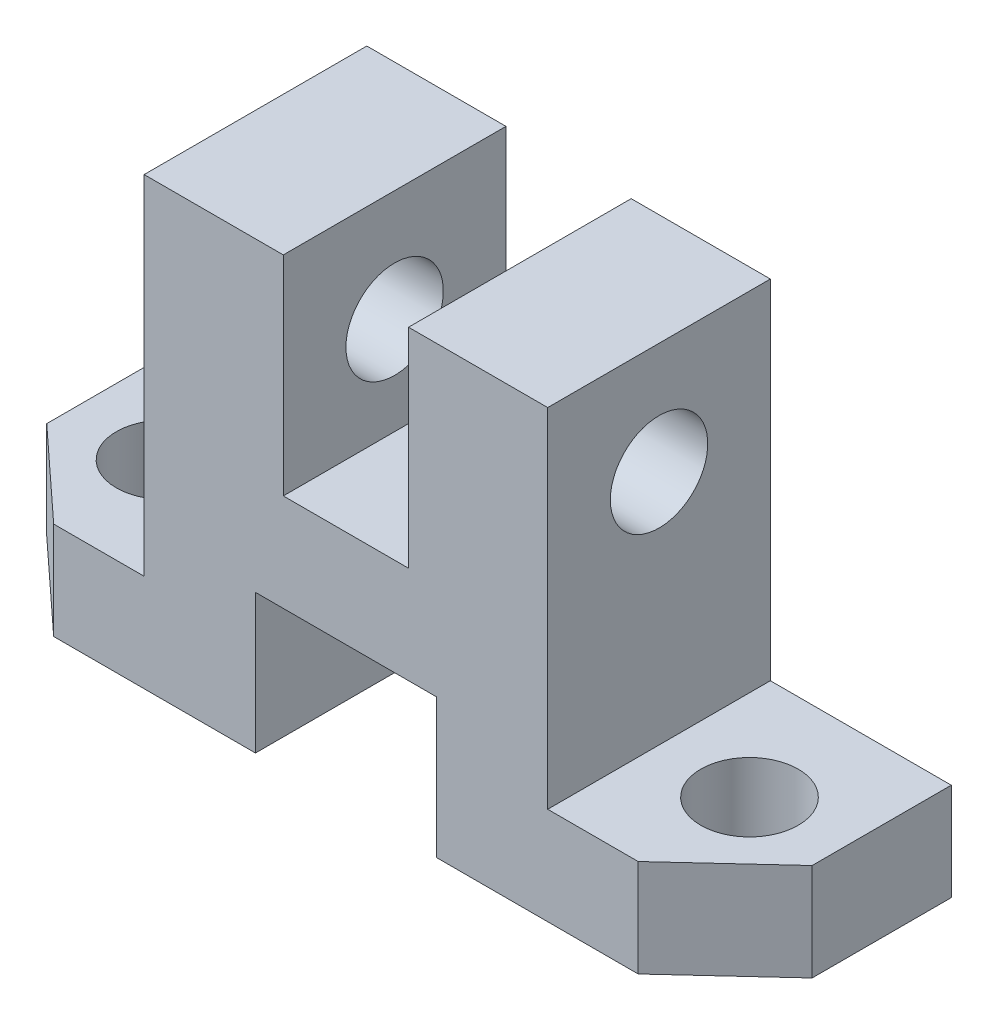
ISO-10303-21;
HEADER;
FILE_DESCRIPTION(('STEP AP214'),'2;1');
FILE_NAME('part.step','',(''),(''),'','','');
FILE_SCHEMA(('AUTOMOTIVE_DESIGN { 1 0 10303 214 1 1 1 1 }'));
ENDSEC;
DATA;
#1=APPLICATION_CONTEXT('core data for automotive mechanical design processes');
#2=APPLICATION_PROTOCOL_DEFINITION('international standard','automotive_design',2000,#1);
#3=PRODUCT_CONTEXT('',#1,'mechanical');
#4=PRODUCT('Part','Part','',(#3));
#5=PRODUCT_RELATED_PRODUCT_CATEGORY('part','',(#4));
#6=PRODUCT_DEFINITION_FORMATION('','',#4);
#7=PRODUCT_DEFINITION_CONTEXT('part definition',#1,'design');
#8=PRODUCT_DEFINITION('design','',#6,#7);
#9=PRODUCT_DEFINITION_SHAPE('','',#8);
#10=(LENGTH_UNIT() NAMED_UNIT(*) SI_UNIT(.MILLI.,.METRE.));
#11=(NAMED_UNIT(*) PLANE_ANGLE_UNIT() SI_UNIT($,.RADIAN.));
#12=(NAMED_UNIT(*) SI_UNIT($,.STERADIAN.) SOLID_ANGLE_UNIT());
#13=UNCERTAINTY_MEASURE_WITH_UNIT(LENGTH_MEASURE(1.E-05),#10,'distance_accuracy_value','');
#14=(GEOMETRIC_REPRESENTATION_CONTEXT(3) GLOBAL_UNCERTAINTY_ASSIGNED_CONTEXT((#13)) GLOBAL_UNIT_ASSIGNED_CONTEXT((#10,
#11,#12)) REPRESENTATION_CONTEXT('',''));
#15=CARTESIAN_POINT('',(0.,0.,0.));
#16=DIRECTION('',(0.,0.,1.));
#17=DIRECTION('',(1.,0.,0.));
#18=AXIS2_PLACEMENT_3D('',#15,#16,#17);
#19=CARTESIAN_POINT('',(0.,0.,16.));
#20=DIRECTION('',(1.,0.,0.));
#21=DIRECTION('',(0.,0.,-1.));
#22=AXIS2_PLACEMENT_3D('',#19,#20,#21);
#23=PLANE('',#22);
#24=DIRECTION('',(0.,1.,0.));
#25=VECTOR('',#24,1.);
#26=CARTESIAN_POINT('',(0.,0.,10.));
#27=LINE('',#26,#25);
#28=CARTESIAN_POINT('',(0.,0.,10.));
#29=VERTEX_POINT('',#28);
#30=CARTESIAN_POINT('',(0.,7.,10.));
#31=VERTEX_POINT('',#30);
#32=EDGE_CURVE('E402',#29,#31,#27,.T.);
#33=ORIENTED_EDGE('',*,*,#32,.T.);
#34=DIRECTION('',(0.,0.,-1.));
#35=VECTOR('',#34,1.);
#36=CARTESIAN_POINT('',(0.,7.,16.));
#37=LINE('',#36,#35);
#38=CARTESIAN_POINT('',(0.,7.,0.));
#39=VERTEX_POINT('',#38);
#40=EDGE_CURVE('E276',#31,#39,#37,.T.);
#41=ORIENTED_EDGE('',*,*,#40,.T.);
#42=DIRECTION('',(0.,-1.,0.));
#43=VECTOR('',#42,1.);
#44=CARTESIAN_POINT('',(0.,0.,0.));
#45=LINE('',#44,#43);
#46=CARTESIAN_POINT('',(0.,0.,0.));
#47=VERTEX_POINT('',#46);
#48=EDGE_CURVE('E236',#39,#47,#45,.T.);
#49=ORIENTED_EDGE('',*,*,#48,.T.);
#50=DIRECTION('',(0.,0.,-1.));
#51=VECTOR('',#50,1.);
#52=CARTESIAN_POINT('',(0.,0.,16.));
#53=LINE('',#52,#51);
#54=EDGE_CURVE('E11',#29,#47,#53,.T.);
#55=ORIENTED_EDGE('',*,*,#54,.F.);
#56=EDGE_LOOP('',(#33,#41,#49,#55));
#57=FACE_BOUND('',#56,.T.);
#58=ADVANCED_FACE('F43',(#57),#23,.F.);
#59=CARTESIAN_POINT('',(0.,0.,16.));
#60=DIRECTION('',(0.,1.,0.));
#61=DIRECTION('',(0.,0.,1.));
#62=AXIS2_PLACEMENT_3D('',#59,#60,#61);
#63=PLANE('',#62);
#64=CARTESIAN_POINT('',(6.5,0.,8.));
#65=DIRECTION('',(0.,1.,0.));
#66=DIRECTION('',(0.,0.,1.));
#67=AXIS2_PLACEMENT_3D('',#64,#65,#66);
#68=CIRCLE('',#67,3.5);
#69=CARTESIAN_POINT('',(6.5,0.,11.5));
#70=VERTEX_POINT('',#69);
#71=EDGE_CURVE('E355',#70,#70,#68,.T.);
#72=ORIENTED_EDGE('',*,*,#71,.T.);
#73=EDGE_LOOP('',(#72));
#74=FACE_BOUND('',#73,.T.);
#75=DIRECTION('',(0.734803444627487,0.,0.678280102733066));
#76=VECTOR('',#75,1.);
#77=CARTESIAN_POINT('',(0.,0.,10.));
#78=LINE('',#77,#76);
#79=CARTESIAN_POINT('',(6.5,0.,16.));
#80=VERTEX_POINT('',#79);
#81=EDGE_CURVE('E67',#29,#80,#78,.T.);
#82=ORIENTED_EDGE('',*,*,#81,.F.);
#83=ORIENTED_EDGE('',*,*,#54,.T.);
#84=DIRECTION('',(1.,0.,0.));
#85=VECTOR('',#84,1.);
#86=CARTESIAN_POINT('',(0.,0.,0.));
#87=LINE('',#86,#85);
#88=CARTESIAN_POINT('',(21.,0.,0.));
#89=VERTEX_POINT('',#88);
#90=EDGE_CURVE('E226',#47,#89,#87,.T.);
#91=ORIENTED_EDGE('',*,*,#90,.T.);
#92=DIRECTION('',(0.,0.,-1.));
#93=VECTOR('',#92,1.);
#94=CARTESIAN_POINT('',(21.,0.,16.));
#95=LINE('',#94,#93);
#96=CARTESIAN_POINT('',(21.,0.,16.));
#97=VERTEX_POINT('',#96);
#98=EDGE_CURVE('E52',#97,#89,#95,.T.);
#99=ORIENTED_EDGE('',*,*,#98,.F.);
#100=DIRECTION('',(1.,0.,0.));
#101=VECTOR('',#100,1.);
#102=CARTESIAN_POINT('',(0.,0.,16.));
#103=LINE('',#102,#101);
#104=EDGE_CURVE('E275',#80,#97,#103,.T.);
#105=ORIENTED_EDGE('',*,*,#104,.F.);
#106=EDGE_LOOP('',(#82,#83,#91,#99,#105));
#107=FACE_BOUND('',#106,.T.);
#108=ADVANCED_FACE('F442',(#74,#107),#63,.F.);
#109=CARTESIAN_POINT('',(0.,7.,16.));
#110=DIRECTION('',(0.,-1.,0.));
#111=DIRECTION('',(0.,0.,-1.));
#112=AXIS2_PLACEMENT_3D('',#109,#110,#111);
#113=PLANE('',#112);
#114=CARTESIAN_POINT('',(6.5,7.,8.));
#115=DIRECTION('',(0.,1.,0.));
#116=DIRECTION('',(0.,0.,1.));
#117=AXIS2_PLACEMENT_3D('',#114,#115,#116);
#118=CIRCLE('',#117,3.5);
#119=CARTESIAN_POINT('',(6.5,7.,11.5));
#120=VERTEX_POINT('',#119);
#121=EDGE_CURVE('E360',#120,#120,#118,.T.);
#122=ORIENTED_EDGE('',*,*,#121,.F.);
#123=EDGE_LOOP('',(#122));
#124=FACE_BOUND('',#123,.T.);
#125=DIRECTION('',(0.734803444627487,0.,0.678280102733066));
#126=VECTOR('',#125,1.);
#127=CARTESIAN_POINT('',(0.,7.,10.));
#128=LINE('',#127,#126);
#129=CARTESIAN_POINT('',(6.5,7.,16.));
#130=VERTEX_POINT('',#129);
#131=EDGE_CURVE('E392',#31,#130,#128,.T.);
#132=ORIENTED_EDGE('',*,*,#131,.T.);
#133=DIRECTION('',(-1.,0.,0.));
#134=VECTOR('',#133,1.);
#135=CARTESIAN_POINT('',(0.,7.,16.));
#136=LINE('',#135,#134);
#137=CARTESIAN_POINT('',(13.,7.,16.));
#138=VERTEX_POINT('',#137);
#139=EDGE_CURVE('E280',#138,#130,#136,.T.);
#140=ORIENTED_EDGE('',*,*,#139,.F.);
#141=DIRECTION('',(0.,0.,-1.));
#142=VECTOR('',#141,1.);
#143=CARTESIAN_POINT('',(13.,7.,16.));
#144=LINE('',#143,#142);
#145=CARTESIAN_POINT('',(13.,7.,0.));
#146=VERTEX_POINT('',#145);
#147=EDGE_CURVE('E279',#138,#146,#144,.T.);
#148=ORIENTED_EDGE('',*,*,#147,.T.);
#149=DIRECTION('',(-1.,0.,0.));
#150=VECTOR('',#149,1.);
#151=CARTESIAN_POINT('',(0.,7.,0.));
#152=LINE('',#151,#150);
#153=EDGE_CURVE('E271',#146,#39,#152,.T.);
#154=ORIENTED_EDGE('',*,*,#153,.T.);
#155=ORIENTED_EDGE('',*,*,#40,.F.);
#156=EDGE_LOOP('',(#132,#140,#148,#154,#155));
#157=FACE_BOUND('',#156,.T.);
#158=ADVANCED_FACE('F446',(#124,#157),#113,.F.);
#159=CARTESIAN_POINT('',(0.,0.,16.));
#160=DIRECTION('',(0.,0.,-1.));
#161=DIRECTION('',(-1.,0.,0.));
#162=AXIS2_PLACEMENT_3D('',#159,#160,#161);
#163=PLANE('',#162);
#164=DIRECTION('',(1.,0.,0.));
#165=VECTOR('',#164,1.);
#166=CARTESIAN_POINT('',(34.,0.,16.));
#167=LINE('',#166,#165);
#168=CARTESIAN_POINT('',(34.,0.,16.));
#169=VERTEX_POINT('',#168);
#170=CARTESIAN_POINT('',(48.5,0.,16.));
#171=VERTEX_POINT('',#170);
#172=EDGE_CURVE('E380',#169,#171,#167,.T.);
#173=ORIENTED_EDGE('',*,*,#172,.T.);
#174=DIRECTION('',(0.,1.,0.));
#175=VECTOR('',#174,1.);
#176=CARTESIAN_POINT('',(48.5,0.,16.));
#177=LINE('',#176,#175);
#178=CARTESIAN_POINT('',(48.5,7.,16.));
#179=VERTEX_POINT('',#178);
#180=EDGE_CURVE('E169',#171,#179,#177,.T.);
#181=ORIENTED_EDGE('',*,*,#180,.T.);
#182=DIRECTION('',(-1.,0.,0.));
#183=VECTOR('',#182,1.);
#184=CARTESIAN_POINT('',(42.,7.,16.));
#185=LINE('',#184,#183);
#186=CARTESIAN_POINT('',(42.,7.,16.));
#187=VERTEX_POINT('',#186);
#188=EDGE_CURVE('E383',#179,#187,#185,.T.);
#189=ORIENTED_EDGE('',*,*,#188,.T.);
#190=DIRECTION('',(0.,1.,0.));
#191=VECTOR('',#190,1.);
#192=CARTESIAN_POINT('',(42.,32.,16.));
#193=LINE('',#192,#191);
#194=CARTESIAN_POINT('',(42.,32.,16.));
#195=VERTEX_POINT('',#194);
#196=EDGE_CURVE('E315',#187,#195,#193,.T.);
#197=ORIENTED_EDGE('',*,*,#196,.T.);
#198=DIRECTION('',(-1.,0.,0.));
#199=VECTOR('',#198,1.);
#200=CARTESIAN_POINT('',(32.,32.,16.));
#201=LINE('',#200,#199);
#202=CARTESIAN_POINT('',(32.,32.,16.));
#203=VERTEX_POINT('',#202);
#204=EDGE_CURVE('E335',#195,#203,#201,.T.);
#205=ORIENTED_EDGE('',*,*,#204,.T.);
#206=DIRECTION('',(0.,-1.,0.));
#207=VECTOR('',#206,1.);
#208=CARTESIAN_POINT('',(32.,17.,16.));
#209=LINE('',#208,#207);
#210=CARTESIAN_POINT('',(32.,17.,16.));
#211=VERTEX_POINT('',#210);
#212=EDGE_CURVE('E330',#203,#211,#209,.T.);
#213=ORIENTED_EDGE('',*,*,#212,.T.);
#214=DIRECTION('',(-1.,0.,0.));
#215=VECTOR('',#214,1.);
#216=CARTESIAN_POINT('',(23.,17.,16.));
#217=LINE('',#216,#215);
#218=CARTESIAN_POINT('',(23.,17.,16.));
#219=VERTEX_POINT('',#218);
#220=EDGE_CURVE('E334',#211,#219,#217,.T.);
#221=ORIENTED_EDGE('',*,*,#220,.T.);
#222=DIRECTION('',(0.,1.,0.));
#223=VECTOR('',#222,1.);
#224=CARTESIAN_POINT('',(23.,32.,16.));
#225=LINE('',#224,#223);
#226=CARTESIAN_POINT('',(23.,32.,16.));
#227=VERTEX_POINT('',#226);
#228=EDGE_CURVE('E339',#219,#227,#225,.T.);
#229=ORIENTED_EDGE('',*,*,#228,.T.);
#230=DIRECTION('',(-1.,0.,0.));
#231=VECTOR('',#230,1.);
#232=CARTESIAN_POINT('',(13.,32.,16.));
#233=LINE('',#232,#231);
#234=CARTESIAN_POINT('',(13.,32.,16.));
#235=VERTEX_POINT('',#234);
#236=EDGE_CURVE('E346',#227,#235,#233,.T.);
#237=ORIENTED_EDGE('',*,*,#236,.T.);
#238=DIRECTION('',(0.,-1.,0.));
#239=VECTOR('',#238,1.);
#240=CARTESIAN_POINT('',(13.,7.,16.));
#241=LINE('',#240,#239);
#242=EDGE_CURVE('E349',#235,#138,#241,.T.);
#243=ORIENTED_EDGE('',*,*,#242,.T.);
#244=ORIENTED_EDGE('',*,*,#139,.T.);
#245=DIRECTION('',(0.,1.,0.));
#246=VECTOR('',#245,1.);
#247=CARTESIAN_POINT('',(6.5,0.,16.));
#248=LINE('',#247,#246);
#249=EDGE_CURVE('E396',#80,#130,#248,.T.);
#250=ORIENTED_EDGE('',*,*,#249,.F.);
#251=ORIENTED_EDGE('',*,*,#104,.T.);
#252=DIRECTION('',(0.,1.,0.));
#253=VECTOR('',#252,1.);
#254=CARTESIAN_POINT('',(21.,0.,16.));
#255=LINE('',#254,#253);
#256=CARTESIAN_POINT('',(21.,10.,16.));
#257=VERTEX_POINT('',#256);
#258=EDGE_CURVE('E218',#97,#257,#255,.T.);
#259=ORIENTED_EDGE('',*,*,#258,.T.);
#260=DIRECTION('',(1.,0.,0.));
#261=VECTOR('',#260,1.);
#262=CARTESIAN_POINT('',(21.,10.,16.));
#263=LINE('',#262,#261);
#264=CARTESIAN_POINT('',(34.,10.,16.));
#265=VERTEX_POINT('',#264);
#266=EDGE_CURVE('E374',#257,#265,#263,.T.);
#267=ORIENTED_EDGE('',*,*,#266,.T.);
#268=DIRECTION('',(0.,-1.,0.));
#269=VECTOR('',#268,1.);
#270=CARTESIAN_POINT('',(34.,10.,16.));
#271=LINE('',#270,#269);
#272=EDGE_CURVE('E377',#265,#169,#271,.T.);
#273=ORIENTED_EDGE('',*,*,#272,.T.);
#274=EDGE_LOOP('',(#173,#181,#189,#197,#205,#213,#221,#229,#237,#243,#244,#250,#251,#259,#267,#273));
#275=FACE_BOUND('',#274,.T.);
#276=ADVANCED_FACE('F386',(#275),#163,.F.);
#277=CARTESIAN_POINT('',(21.,0.,16.));
#278=DIRECTION('',(-1.,0.,0.));
#279=DIRECTION('',(0.,0.,1.));
#280=AXIS2_PLACEMENT_3D('',#277,#278,#279);
#281=PLANE('',#280);
#282=DIRECTION('',(0.,1.,0.));
#283=VECTOR('',#282,1.);
#284=CARTESIAN_POINT('',(21.,0.,0.));
#285=LINE('',#284,#283);
#286=CARTESIAN_POINT('',(21.,10.,0.));
#287=VERTEX_POINT('',#286);
#288=EDGE_CURVE('E217',#89,#287,#285,.T.);
#289=ORIENTED_EDGE('',*,*,#288,.T.);
#290=DIRECTION('',(0.,0.,-1.));
#291=VECTOR('',#290,1.);
#292=CARTESIAN_POINT('',(21.,10.,16.));
#293=LINE('',#292,#291);
#294=EDGE_CURVE('E205',#257,#287,#293,.T.);
#295=ORIENTED_EDGE('',*,*,#294,.F.);
#296=ORIENTED_EDGE('',*,*,#258,.F.);
#297=ORIENTED_EDGE('',*,*,#98,.T.);
#298=EDGE_LOOP('',(#289,#295,#296,#297));
#299=FACE_BOUND('',#298,.T.);
#300=ADVANCED_FACE('F215',(#299),#281,.F.);
#301=CARTESIAN_POINT('',(21.,10.,16.));
#302=DIRECTION('',(0.,1.,0.));
#303=DIRECTION('',(0.,0.,1.));
#304=AXIS2_PLACEMENT_3D('',#301,#302,#303);
#305=PLANE('',#304);
#306=DIRECTION('',(1.,0.,0.));
#307=VECTOR('',#306,1.);
#308=CARTESIAN_POINT('',(21.,10.,0.));
#309=LINE('',#308,#307);
#310=CARTESIAN_POINT('',(34.,10.,0.));
#311=VERTEX_POINT('',#310);
#312=EDGE_CURVE('E229',#287,#311,#309,.T.);
#313=ORIENTED_EDGE('',*,*,#312,.T.);
#314=DIRECTION('',(0.,0.,-1.));
#315=VECTOR('',#314,1.);
#316=CARTESIAN_POINT('',(34.,10.,16.));
#317=LINE('',#316,#315);
#318=EDGE_CURVE('E196',#265,#311,#317,.T.);
#319=ORIENTED_EDGE('',*,*,#318,.F.);
#320=ORIENTED_EDGE('',*,*,#266,.F.);
#321=ORIENTED_EDGE('',*,*,#294,.T.);
#322=EDGE_LOOP('',(#313,#319,#320,#321));
#323=FACE_BOUND('',#322,.T.);
#324=ADVANCED_FACE('F502',(#323),#305,.F.);
#325=CARTESIAN_POINT('',(34.,10.,16.));
#326=DIRECTION('',(1.,0.,0.));
#327=DIRECTION('',(0.,0.,-1.));
#328=AXIS2_PLACEMENT_3D('',#325,#326,#327);
#329=PLANE('',#328);
#330=DIRECTION('',(0.,-1.,0.));
#331=VECTOR('',#330,1.);
#332=CARTESIAN_POINT('',(34.,10.,0.));
#333=LINE('',#332,#331);
#334=CARTESIAN_POINT('',(34.,0.,0.));
#335=VERTEX_POINT('',#334);
#336=EDGE_CURVE('E234',#311,#335,#333,.T.);
#337=ORIENTED_EDGE('',*,*,#336,.T.);
#338=DIRECTION('',(0.,0.,-1.));
#339=VECTOR('',#338,1.);
#340=CARTESIAN_POINT('',(34.,0.,16.));
#341=LINE('',#340,#339);
#342=EDGE_CURVE('E192',#169,#335,#341,.T.);
#343=ORIENTED_EDGE('',*,*,#342,.F.);
#344=ORIENTED_EDGE('',*,*,#272,.F.);
#345=ORIENTED_EDGE('',*,*,#318,.T.);
#346=EDGE_LOOP('',(#337,#343,#344,#345));
#347=FACE_BOUND('',#346,.T.);
#348=ADVANCED_FACE('F499',(#347),#329,.F.);
#349=CARTESIAN_POINT('',(34.,0.,16.));
#350=DIRECTION('',(0.,1.,0.));
#351=DIRECTION('',(0.,0.,1.));
#352=AXIS2_PLACEMENT_3D('',#349,#350,#351);
#353=PLANE('',#352);
#354=CARTESIAN_POINT('',(48.5,0.,8.));
#355=DIRECTION('',(0.,1.,0.));
#356=DIRECTION('',(0.,0.,1.));
#357=AXIS2_PLACEMENT_3D('',#354,#355,#356);
#358=CIRCLE('',#357,3.5);
#359=CARTESIAN_POINT('',(48.5,0.,11.5));
#360=VERTEX_POINT('',#359);
#361=EDGE_CURVE('E366',#360,#360,#358,.T.);
#362=ORIENTED_EDGE('',*,*,#361,.T.);
#363=EDGE_LOOP('',(#362));
#364=FACE_BOUND('',#363,.T.);
#365=DIRECTION('',(0.,0.,-1.));
#366=VECTOR('',#365,1.);
#367=CARTESIAN_POINT('',(55.,0.,16.));
#368=LINE('',#367,#366);
#369=CARTESIAN_POINT('',(55.,0.,10.));
#370=VERTEX_POINT('',#369);
#371=CARTESIAN_POINT('',(55.,0.,0.));
#372=VERTEX_POINT('',#371);
#373=EDGE_CURVE('E181',#370,#372,#368,.T.);
#374=ORIENTED_EDGE('',*,*,#373,.F.);
#375=DIRECTION('',(-0.734803444627488,0.,0.678280102733066));
#376=VECTOR('',#375,1.);
#377=CARTESIAN_POINT('',(48.5,0.,16.));
#378=LINE('',#377,#376);
#379=EDGE_CURVE('E166',#370,#171,#378,.T.);
#380=ORIENTED_EDGE('',*,*,#379,.T.);
#381=ORIENTED_EDGE('',*,*,#172,.F.);
#382=ORIENTED_EDGE('',*,*,#342,.T.);
#383=DIRECTION('',(1.,0.,0.));
#384=VECTOR('',#383,1.);
#385=CARTESIAN_POINT('',(34.,0.,0.));
#386=LINE('',#385,#384);
#387=EDGE_CURVE('E189',#335,#372,#386,.T.);
#388=ORIENTED_EDGE('',*,*,#387,.T.);
#389=EDGE_LOOP('',(#374,#380,#381,#382,#388));
#390=FACE_BOUND('',#389,.T.);
#391=ADVANCED_FACE('F186',(#364,#390),#353,.F.);
#392=CARTESIAN_POINT('',(55.,7.,16.));
#393=DIRECTION('',(-1.,0.,0.));
#394=DIRECTION('',(0.,0.,1.));
#395=AXIS2_PLACEMENT_3D('',#392,#393,#394);
#396=PLANE('',#395);
#397=DIRECTION('',(0.,0.,-1.));
#398=VECTOR('',#397,1.);
#399=CARTESIAN_POINT('',(55.,7.,16.));
#400=LINE('',#399,#398);
#401=CARTESIAN_POINT('',(55.,7.,10.));
#402=VERTEX_POINT('',#401);
#403=CARTESIAN_POINT('',(55.,7.,0.));
#404=VERTEX_POINT('',#403);
#405=EDGE_CURVE('E183',#402,#404,#400,.T.);
#406=ORIENTED_EDGE('',*,*,#405,.F.);
#407=DIRECTION('',(0.,1.,0.));
#408=VECTOR('',#407,1.);
#409=CARTESIAN_POINT('',(55.,0.,10.));
#410=LINE('',#409,#408);
#411=EDGE_CURVE('E59',#370,#402,#410,.T.);
#412=ORIENTED_EDGE('',*,*,#411,.F.);
#413=ORIENTED_EDGE('',*,*,#373,.T.);
#414=DIRECTION('',(0.,1.,0.));
#415=VECTOR('',#414,1.);
#416=CARTESIAN_POINT('',(55.,7.,0.));
#417=LINE('',#416,#415);
#418=EDGE_CURVE('E244',#372,#404,#417,.T.);
#419=ORIENTED_EDGE('',*,*,#418,.T.);
#420=EDGE_LOOP('',(#406,#412,#413,#419));
#421=FACE_BOUND('',#420,.T.);
#422=ADVANCED_FACE('F179',(#421),#396,.F.);
#423=CARTESIAN_POINT('',(42.,7.,16.));
#424=DIRECTION('',(0.,-1.,0.));
#425=DIRECTION('',(0.,0.,-1.));
#426=AXIS2_PLACEMENT_3D('',#423,#424,#425);
#427=PLANE('',#426);
#428=CARTESIAN_POINT('',(48.5,7.,8.));
#429=DIRECTION('',(0.,1.,0.));
#430=DIRECTION('',(0.,0.,1.));
#431=AXIS2_PLACEMENT_3D('',#428,#429,#430);
#432=CIRCLE('',#431,3.5);
#433=CARTESIAN_POINT('',(48.5,7.,11.5));
#434=VERTEX_POINT('',#433);
#435=EDGE_CURVE('E418',#434,#434,#432,.T.);
#436=ORIENTED_EDGE('',*,*,#435,.F.);
#437=EDGE_LOOP('',(#436));
#438=FACE_BOUND('',#437,.T.);
#439=ORIENTED_EDGE('',*,*,#188,.F.);
#440=DIRECTION('',(-0.734803444627488,0.,0.678280102733066));
#441=VECTOR('',#440,1.);
#442=CARTESIAN_POINT('',(48.5,7.,16.));
#443=LINE('',#442,#441);
#444=EDGE_CURVE('E175',#402,#179,#443,.T.);
#445=ORIENTED_EDGE('',*,*,#444,.F.);
#446=ORIENTED_EDGE('',*,*,#405,.T.);
#447=DIRECTION('',(-1.,0.,0.));
#448=VECTOR('',#447,1.);
#449=CARTESIAN_POINT('',(42.,7.,0.));
#450=LINE('',#449,#448);
#451=CARTESIAN_POINT('',(42.,7.,0.));
#452=VERTEX_POINT('',#451);
#453=EDGE_CURVE('E247',#404,#452,#450,.T.);
#454=ORIENTED_EDGE('',*,*,#453,.T.);
#455=DIRECTION('',(0.,0.,-1.));
#456=VECTOR('',#455,1.);
#457=CARTESIAN_POINT('',(42.,7.,16.));
#458=LINE('',#457,#456);
#459=EDGE_CURVE('E198',#187,#452,#458,.T.);
#460=ORIENTED_EDGE('',*,*,#459,.F.);
#461=EDGE_LOOP('',(#439,#445,#446,#454,#460));
#462=FACE_BOUND('',#461,.T.);
#463=ADVANCED_FACE('F387',(#438,#462),#427,.F.);
#464=CARTESIAN_POINT('',(42.,32.,16.));
#465=DIRECTION('',(-1.,0.,0.));
#466=DIRECTION('',(0.,0.,1.));
#467=AXIS2_PLACEMENT_3D('',#464,#465,#466);
#468=PLANE('',#467);
#469=CARTESIAN_POINT('',(42.,24.,8.));
#470=DIRECTION('',(-1.,0.,0.));
#471=DIRECTION('',(0.,0.,1.));
#472=AXIS2_PLACEMENT_3D('',#469,#470,#471);
#473=CIRCLE('',#472,3.5);
#474=CARTESIAN_POINT('',(42.,24.,11.5));
#475=VERTEX_POINT('',#474);
#476=EDGE_CURVE('E414',#475,#475,#473,.T.);
#477=ORIENTED_EDGE('',*,*,#476,.T.);
#478=EDGE_LOOP('',(#477));
#479=FACE_BOUND('',#478,.T.);
#480=DIRECTION('',(0.,1.,0.));
#481=VECTOR('',#480,1.);
#482=CARTESIAN_POINT('',(42.,32.,0.));
#483=LINE('',#482,#481);
#484=CARTESIAN_POINT('',(42.,32.,0.));
#485=VERTEX_POINT('',#484);
#486=EDGE_CURVE('E250',#452,#485,#483,.T.);
#487=ORIENTED_EDGE('',*,*,#486,.T.);
#488=DIRECTION('',(0.,0.,-1.));
#489=VECTOR('',#488,1.);
#490=CARTESIAN_POINT('',(42.,32.,16.));
#491=LINE('',#490,#489);
#492=EDGE_CURVE('E304',#195,#485,#491,.T.);
#493=ORIENTED_EDGE('',*,*,#492,.F.);
#494=ORIENTED_EDGE('',*,*,#196,.F.);
#495=ORIENTED_EDGE('',*,*,#459,.T.);
#496=EDGE_LOOP('',(#487,#493,#494,#495));
#497=FACE_BOUND('',#496,.T.);
#498=ADVANCED_FACE('F313',(#479,#497),#468,.F.);
#499=CARTESIAN_POINT('',(32.,32.,16.));
#500=DIRECTION('',(0.,-1.,0.));
#501=DIRECTION('',(0.,0.,-1.));
#502=AXIS2_PLACEMENT_3D('',#499,#500,#501);
#503=PLANE('',#502);
#504=DIRECTION('',(-1.,0.,0.));
#505=VECTOR('',#504,1.);
#506=CARTESIAN_POINT('',(32.,32.,0.));
#507=LINE('',#506,#505);
#508=CARTESIAN_POINT('',(32.,32.,0.));
#509=VERTEX_POINT('',#508);
#510=EDGE_CURVE('E253',#485,#509,#507,.T.);
#511=ORIENTED_EDGE('',*,*,#510,.T.);
#512=DIRECTION('',(0.,0.,-1.));
#513=VECTOR('',#512,1.);
#514=CARTESIAN_POINT('',(32.,32.,16.));
#515=LINE('',#514,#513);
#516=EDGE_CURVE('E300',#203,#509,#515,.T.);
#517=ORIENTED_EDGE('',*,*,#516,.F.);
#518=ORIENTED_EDGE('',*,*,#204,.F.);
#519=ORIENTED_EDGE('',*,*,#492,.T.);
#520=EDGE_LOOP('',(#511,#517,#518,#519));
#521=FACE_BOUND('',#520,.T.);
#522=ADVANCED_FACE('F324',(#521),#503,.F.);
#523=CARTESIAN_POINT('',(32.,17.,16.));
#524=DIRECTION('',(1.,0.,0.));
#525=DIRECTION('',(0.,0.,-1.));
#526=AXIS2_PLACEMENT_3D('',#523,#524,#525);
#527=PLANE('',#526);
#528=CARTESIAN_POINT('',(32.,24.,8.));
#529=DIRECTION('',(1.,0.,0.));
#530=DIRECTION('',(0.,0.,-1.));
#531=AXIS2_PLACEMENT_3D('',#528,#529,#530);
#532=CIRCLE('',#531,3.5);
#533=CARTESIAN_POINT('',(32.,24.,11.5));
#534=VERTEX_POINT('',#533);
#535=EDGE_CURVE('E410',#534,#534,#532,.T.);
#536=ORIENTED_EDGE('',*,*,#535,.T.);
#537=EDGE_LOOP('',(#536));
#538=FACE_BOUND('',#537,.T.);
#539=DIRECTION('',(0.,-1.,0.));
#540=VECTOR('',#539,1.);
#541=CARTESIAN_POINT('',(32.,17.,0.));
#542=LINE('',#541,#540);
#543=CARTESIAN_POINT('',(32.,17.,0.));
#544=VERTEX_POINT('',#543);
#545=EDGE_CURVE('E256',#509,#544,#542,.T.);
#546=ORIENTED_EDGE('',*,*,#545,.T.);
#547=DIRECTION('',(0.,0.,-1.));
#548=VECTOR('',#547,1.);
#549=CARTESIAN_POINT('',(32.,17.,16.));
#550=LINE('',#549,#548);
#551=EDGE_CURVE('E296',#211,#544,#550,.T.);
#552=ORIENTED_EDGE('',*,*,#551,.F.);
#553=ORIENTED_EDGE('',*,*,#212,.F.);
#554=ORIENTED_EDGE('',*,*,#516,.T.);
#555=EDGE_LOOP('',(#546,#552,#553,#554));
#556=FACE_BOUND('',#555,.T.);
#557=ADVANCED_FACE('F328',(#538,#556),#527,.F.);
#558=CARTESIAN_POINT('',(23.,17.,16.));
#559=DIRECTION('',(0.,-1.,0.));
#560=DIRECTION('',(0.,0.,-1.));
#561=AXIS2_PLACEMENT_3D('',#558,#559,#560);
#562=PLANE('',#561);
#563=DIRECTION('',(-1.,0.,0.));
#564=VECTOR('',#563,1.);
#565=CARTESIAN_POINT('',(23.,17.,0.));
#566=LINE('',#565,#564);
#567=CARTESIAN_POINT('',(23.,17.,0.));
#568=VERTEX_POINT('',#567);
#569=EDGE_CURVE('E259',#544,#568,#566,.T.);
#570=ORIENTED_EDGE('',*,*,#569,.T.);
#571=DIRECTION('',(0.,0.,-1.));
#572=VECTOR('',#571,1.);
#573=CARTESIAN_POINT('',(23.,17.,16.));
#574=LINE('',#573,#572);
#575=EDGE_CURVE('E292',#219,#568,#574,.T.);
#576=ORIENTED_EDGE('',*,*,#575,.F.);
#577=ORIENTED_EDGE('',*,*,#220,.F.);
#578=ORIENTED_EDGE('',*,*,#551,.T.);
#579=EDGE_LOOP('',(#570,#576,#577,#578));
#580=FACE_BOUND('',#579,.T.);
#581=ADVANCED_FACE('F468',(#580),#562,.F.);
#582=CARTESIAN_POINT('',(23.,32.,16.));
#583=DIRECTION('',(-1.,0.,0.));
#584=DIRECTION('',(0.,0.,1.));
#585=AXIS2_PLACEMENT_3D('',#582,#583,#584);
#586=PLANE('',#585);
#587=CARTESIAN_POINT('',(23.,24.,8.));
#588=DIRECTION('',(-1.,0.,0.));
#589=DIRECTION('',(0.,0.,1.));
#590=AXIS2_PLACEMENT_3D('',#587,#588,#589);
#591=CIRCLE('',#590,3.5);
#592=CARTESIAN_POINT('',(23.,24.,11.5));
#593=VERTEX_POINT('',#592);
#594=EDGE_CURVE('E406',#593,#593,#591,.T.);
#595=ORIENTED_EDGE('',*,*,#594,.T.);
#596=EDGE_LOOP('',(#595));
#597=FACE_BOUND('',#596,.T.);
#598=DIRECTION('',(0.,1.,0.));
#599=VECTOR('',#598,1.);
#600=CARTESIAN_POINT('',(23.,32.,0.));
#601=LINE('',#600,#599);
#602=CARTESIAN_POINT('',(23.,32.,0.));
#603=VERTEX_POINT('',#602);
#604=EDGE_CURVE('E262',#568,#603,#601,.T.);
#605=ORIENTED_EDGE('',*,*,#604,.T.);
#606=DIRECTION('',(0.,0.,-1.));
#607=VECTOR('',#606,1.);
#608=CARTESIAN_POINT('',(23.,32.,16.));
#609=LINE('',#608,#607);
#610=EDGE_CURVE('E288',#227,#603,#609,.T.);
#611=ORIENTED_EDGE('',*,*,#610,.F.);
#612=ORIENTED_EDGE('',*,*,#228,.F.);
#613=ORIENTED_EDGE('',*,*,#575,.T.);
#614=EDGE_LOOP('',(#605,#611,#612,#613));
#615=FACE_BOUND('',#614,.T.);
#616=ADVANCED_FACE('F465',(#597,#615),#586,.F.);
#617=CARTESIAN_POINT('',(13.,32.,16.));
#618=DIRECTION('',(0.,-1.,0.));
#619=DIRECTION('',(0.,0.,-1.));
#620=AXIS2_PLACEMENT_3D('',#617,#618,#619);
#621=PLANE('',#620);
#622=DIRECTION('',(-1.,0.,0.));
#623=VECTOR('',#622,1.);
#624=CARTESIAN_POINT('',(13.,32.,0.));
#625=LINE('',#624,#623);
#626=CARTESIAN_POINT('',(13.,32.,0.));
#627=VERTEX_POINT('',#626);
#628=EDGE_CURVE('E265',#603,#627,#625,.T.);
#629=ORIENTED_EDGE('',*,*,#628,.T.);
#630=DIRECTION('',(0.,0.,-1.));
#631=VECTOR('',#630,1.);
#632=CARTESIAN_POINT('',(13.,32.,16.));
#633=LINE('',#632,#631);
#634=EDGE_CURVE('E284',#235,#627,#633,.T.);
#635=ORIENTED_EDGE('',*,*,#634,.F.);
#636=ORIENTED_EDGE('',*,*,#236,.F.);
#637=ORIENTED_EDGE('',*,*,#610,.T.);
#638=EDGE_LOOP('',(#629,#635,#636,#637));
#639=FACE_BOUND('',#638,.T.);
#640=ADVANCED_FACE('F461',(#639),#621,.F.);
#641=CARTESIAN_POINT('',(13.,7.,16.));
#642=DIRECTION('',(1.,0.,0.));
#643=DIRECTION('',(0.,0.,-1.));
#644=AXIS2_PLACEMENT_3D('',#641,#642,#643);
#645=PLANE('',#644);
#646=CARTESIAN_POINT('',(13.,24.,8.));
#647=DIRECTION('',(1.,0.,0.));
#648=DIRECTION('',(0.,0.,-1.));
#649=AXIS2_PLACEMENT_3D('',#646,#647,#648);
#650=CIRCLE('',#649,3.5);
#651=CARTESIAN_POINT('',(13.,24.,11.5));
#652=VERTEX_POINT('',#651);
#653=EDGE_CURVE('E46',#652,#652,#650,.T.);
#654=ORIENTED_EDGE('',*,*,#653,.T.);
#655=EDGE_LOOP('',(#654));
#656=FACE_BOUND('',#655,.T.);
#657=DIRECTION('',(0.,-1.,0.));
#658=VECTOR('',#657,1.);
#659=CARTESIAN_POINT('',(13.,7.,0.));
#660=LINE('',#659,#658);
#661=EDGE_CURVE('E268',#627,#146,#660,.T.);
#662=ORIENTED_EDGE('',*,*,#661,.T.);
#663=ORIENTED_EDGE('',*,*,#147,.F.);
#664=ORIENTED_EDGE('',*,*,#242,.F.);
#665=ORIENTED_EDGE('',*,*,#634,.T.);
#666=EDGE_LOOP('',(#662,#663,#664,#665));
#667=FACE_BOUND('',#666,.T.);
#668=ADVANCED_FACE('F456',(#656,#667),#645,.F.);
#669=CARTESIAN_POINT('',(0.,0.,0.));
#670=DIRECTION('',(0.,0.,-1.));
#671=DIRECTION('',(-1.,0.,0.));
#672=AXIS2_PLACEMENT_3D('',#669,#670,#671);
#673=PLANE('',#672);
#674=ORIENTED_EDGE('',*,*,#48,.F.);
#675=ORIENTED_EDGE('',*,*,#153,.F.);
#676=ORIENTED_EDGE('',*,*,#661,.F.);
#677=ORIENTED_EDGE('',*,*,#628,.F.);
#678=ORIENTED_EDGE('',*,*,#604,.F.);
#679=ORIENTED_EDGE('',*,*,#569,.F.);
#680=ORIENTED_EDGE('',*,*,#545,.F.);
#681=ORIENTED_EDGE('',*,*,#510,.F.);
#682=ORIENTED_EDGE('',*,*,#486,.F.);
#683=ORIENTED_EDGE('',*,*,#453,.F.);
#684=ORIENTED_EDGE('',*,*,#418,.F.);
#685=ORIENTED_EDGE('',*,*,#387,.F.);
#686=ORIENTED_EDGE('',*,*,#336,.F.);
#687=ORIENTED_EDGE('',*,*,#312,.F.);
#688=ORIENTED_EDGE('',*,*,#288,.F.);
#689=ORIENTED_EDGE('',*,*,#90,.F.);
#690=EDGE_LOOP('',(#674,#675,#676,#677,#678,#679,#680,#681,#682,#683,#684,#685,#686,#687,#688,#689));
#691=FACE_BOUND('',#690,.T.);
#692=ADVANCED_FACE('F225',(#691),#673,.T.);
#693=CARTESIAN_POINT('',(6.5,-9.,8.));
#694=DIRECTION('',(0.,1.,0.));
#695=DIRECTION('',(0.,0.,1.));
#696=AXIS2_PLACEMENT_3D('',#693,#694,#695);
#697=CYLINDRICAL_SURFACE('',#696,3.5);
#698=ORIENTED_EDGE('',*,*,#121,.T.);
#699=EDGE_LOOP('',(#698));
#700=FACE_BOUND('',#699,.T.);
#701=ORIENTED_EDGE('',*,*,#71,.F.);
#702=EDGE_LOOP('',(#701));
#703=FACE_BOUND('',#702,.T.);
#704=ADVANCED_FACE('F429',(#700,#703),#697,.F.);
#705=CARTESIAN_POINT('',(48.5,-9.,8.));
#706=DIRECTION('',(0.,1.,0.));
#707=DIRECTION('',(0.,0.,1.));
#708=AXIS2_PLACEMENT_3D('',#705,#706,#707);
#709=CYLINDRICAL_SURFACE('',#708,3.5);
#710=ORIENTED_EDGE('',*,*,#435,.T.);
#711=EDGE_LOOP('',(#710));
#712=FACE_BOUND('',#711,.T.);
#713=ORIENTED_EDGE('',*,*,#361,.F.);
#714=EDGE_LOOP('',(#713));
#715=FACE_BOUND('',#714,.T.);
#716=ADVANCED_FACE('F426',(#712,#715),#709,.F.);
#717=CARTESIAN_POINT('',(55.,24.,8.));
#718=DIRECTION('',(-1.,0.,0.));
#719=DIRECTION('',(0.,0.,1.));
#720=AXIS2_PLACEMENT_3D('',#717,#718,#719);
#721=CYLINDRICAL_SURFACE('',#720,3.5);
#722=CARTESIAN_POINT('',(13.,24.,11.5));
#723=CARTESIAN_POINT('',(13.1041666666667,24.,11.5));
#724=CARTESIAN_POINT('',(13.2083333333333,24.,11.5));
#725=CARTESIAN_POINT('',(13.4166666666667,24.,11.5));
#726=CARTESIAN_POINT('',(13.5208333333333,24.,11.5));
#727=CARTESIAN_POINT('',(13.7291666666667,24.,11.5));
#728=CARTESIAN_POINT('',(13.8333333333333,24.,11.5));
#729=CARTESIAN_POINT('',(14.0416666666667,24.,11.5));
#730=CARTESIAN_POINT('',(14.1458333333333,24.,11.5));
#731=CARTESIAN_POINT('',(14.3541666666667,24.,11.5));
#732=CARTESIAN_POINT('',(14.4583333333333,24.,11.5));
#733=CARTESIAN_POINT('',(14.6666666666667,24.,11.5));
#734=CARTESIAN_POINT('',(14.7708333333333,24.,11.5));
#735=CARTESIAN_POINT('',(14.9791666666667,24.,11.5));
#736=CARTESIAN_POINT('',(15.0833333333333,24.,11.5));
#737=CARTESIAN_POINT('',(15.2916666666667,24.,11.5));
#738=CARTESIAN_POINT('',(15.3958333333333,24.,11.5));
#739=CARTESIAN_POINT('',(15.6041666666667,24.,11.5));
#740=CARTESIAN_POINT('',(15.7083333333333,24.,11.5));
#741=CARTESIAN_POINT('',(15.9166666666667,24.,11.5));
#742=CARTESIAN_POINT('',(16.0208333333333,24.,11.5));
#743=CARTESIAN_POINT('',(16.2291666666667,24.,11.5));
#744=CARTESIAN_POINT('',(16.3333333333333,24.,11.5));
#745=CARTESIAN_POINT('',(16.5416666666667,24.,11.5));
#746=CARTESIAN_POINT('',(16.6458333333333,24.,11.5));
#747=CARTESIAN_POINT('',(16.8541666666667,24.,11.5));
#748=CARTESIAN_POINT('',(16.9583333333333,24.,11.5));
#749=CARTESIAN_POINT('',(17.1666666666667,24.,11.5));
#750=CARTESIAN_POINT('',(17.2708333333333,24.,11.5));
#751=CARTESIAN_POINT('',(17.4791666666667,24.,11.5));
#752=CARTESIAN_POINT('',(17.5833333333333,24.,11.5));
#753=CARTESIAN_POINT('',(17.7916666666667,24.,11.5));
#754=CARTESIAN_POINT('',(17.8958333333333,24.,11.5));
#755=CARTESIAN_POINT('',(18.1041666666667,24.,11.5));
#756=CARTESIAN_POINT('',(18.2083333333333,24.,11.5));
#757=CARTESIAN_POINT('',(18.4166666666667,24.,11.5));
#758=CARTESIAN_POINT('',(18.5208333333333,24.,11.5));
#759=CARTESIAN_POINT('',(18.7291666666667,24.,11.5));
#760=CARTESIAN_POINT('',(18.8333333333333,24.,11.5));
#761=CARTESIAN_POINT('',(19.0416666666667,24.,11.5));
#762=CARTESIAN_POINT('',(19.1458333333333,24.,11.5));
#763=CARTESIAN_POINT('',(19.3541666666667,24.,11.5));
#764=CARTESIAN_POINT('',(19.4583333333333,24.,11.5));
#765=CARTESIAN_POINT('',(19.6666666666667,24.,11.5));
#766=CARTESIAN_POINT('',(19.7708333333333,24.,11.5));
#767=CARTESIAN_POINT('',(19.9791666666667,24.,11.5));
#768=CARTESIAN_POINT('',(20.0833333333333,24.,11.5));
#769=CARTESIAN_POINT('',(20.2916666666667,24.,11.5));
#770=CARTESIAN_POINT('',(20.3958333333333,24.,11.5));
#771=CARTESIAN_POINT('',(20.6041666666667,24.,11.5));
#772=CARTESIAN_POINT('',(20.7083333333333,24.,11.5));
#773=CARTESIAN_POINT('',(20.9166666666667,24.,11.5));
#774=CARTESIAN_POINT('',(21.0208333333333,24.,11.5));
#775=CARTESIAN_POINT('',(21.2291666666667,24.,11.5));
#776=CARTESIAN_POINT('',(21.3333333333333,24.,11.5));
#777=CARTESIAN_POINT('',(21.5416666666667,24.,11.5));
#778=CARTESIAN_POINT('',(21.6458333333333,24.,11.5));
#779=CARTESIAN_POINT('',(21.8541666666667,24.,11.5));
#780=CARTESIAN_POINT('',(21.9583333333333,24.,11.5));
#781=CARTESIAN_POINT('',(22.1666666666667,24.,11.5));
#782=CARTESIAN_POINT('',(22.2708333333333,24.,11.5));
#783=CARTESIAN_POINT('',(22.4791666666667,24.,11.5));
#784=CARTESIAN_POINT('',(22.5833333333333,24.,11.5));
#785=CARTESIAN_POINT('',(22.7916666666667,24.,11.5));
#786=CARTESIAN_POINT('',(22.8958333333333,24.,11.5));
#787=CARTESIAN_POINT('',(23.,24.,11.5));
#788=B_SPLINE_CURVE_WITH_KNOTS('',3,(#722,#723,#724,#725,#726,#727,#728,#729,#730,#731,#732,
#733,#734,#735,#736,#737,#738,#739,#740,#741,#742,#743,#744,#745,#746,#747,#748,#749,#750,#751,
#752,#753,#754,#755,#756,#757,#758,#759,#760,#761,#762,#763,#764,#765,#766,#767,#768,#769,#770,
#771,#772,#773,#774,#775,#776,#777,#778,#779,#780,#781,#782,#783,#784,#785,#786,#787),
.UNSPECIFIED.,.F.,.F.,(4,2,2,2,2,2,2,2,2,2,2,2,2,2,2,2,2,2,2,2,2,2,2,2,2,2,2,2,2,2,2,2,4),(0.,
0.3125,0.625000000000001,0.937500000000001,1.25,1.5625,1.875,2.1875,2.5,2.8125,3.125,3.4375,
3.75,4.0625,4.375,4.6875,5.,5.3125,5.62500000000001,5.93750000000001,6.25000000000001,
6.56250000000001,6.87500000000001,7.18750000000001,7.50000000000001,7.81250000000001,
8.12500000000001,8.43750000000001,8.75000000000001,9.06250000000001,9.37500000000001,
9.68750000000001,10.),.UNSPECIFIED.);
#789=EDGE_CURVE('BSEAM428',#652,#593,#788,.T.);
#790=ORIENTED_EDGE('',*,*,#653,.F.);
#791=ORIENTED_EDGE('',*,*,#594,.F.);
#792=ORIENTED_EDGE('',*,*,#789,.T.);
#793=ORIENTED_EDGE('',*,*,#789,.F.);
#794=EDGE_LOOP('',(#790,#792,#791,#793));
#795=FACE_BOUND('',#794,.T.);
#796=ADVANCED_FACE('F428',(#795),#721,.F.);
#797=CARTESIAN_POINT('',(32.,24.,11.5));
#798=CARTESIAN_POINT('',(32.1041666666667,24.,11.5));
#799=CARTESIAN_POINT('',(32.2083333333333,24.,11.5));
#800=CARTESIAN_POINT('',(32.4166666666667,24.,11.5));
#801=CARTESIAN_POINT('',(32.5208333333333,24.,11.5));
#802=CARTESIAN_POINT('',(32.7291666666667,24.,11.5));
#803=CARTESIAN_POINT('',(32.8333333333333,24.,11.5));
#804=CARTESIAN_POINT('',(33.0416666666667,24.,11.5));
#805=CARTESIAN_POINT('',(33.1458333333333,24.,11.5));
#806=CARTESIAN_POINT('',(33.3541666666667,24.,11.5));
#807=CARTESIAN_POINT('',(33.4583333333333,24.,11.5));
#808=CARTESIAN_POINT('',(33.6666666666667,24.,11.5));
#809=CARTESIAN_POINT('',(33.7708333333333,24.,11.5));
#810=CARTESIAN_POINT('',(33.9791666666667,24.,11.5));
#811=CARTESIAN_POINT('',(34.0833333333333,24.,11.5));
#812=CARTESIAN_POINT('',(34.2916666666667,24.,11.5));
#813=CARTESIAN_POINT('',(34.3958333333333,24.,11.5));
#814=CARTESIAN_POINT('',(34.6041666666667,24.,11.5));
#815=CARTESIAN_POINT('',(34.7083333333333,24.,11.5));
#816=CARTESIAN_POINT('',(34.9166666666667,24.,11.5));
#817=CARTESIAN_POINT('',(35.0208333333333,24.,11.5));
#818=CARTESIAN_POINT('',(35.2291666666667,24.,11.5));
#819=CARTESIAN_POINT('',(35.3333333333333,24.,11.5));
#820=CARTESIAN_POINT('',(35.5416666666667,24.,11.5));
#821=CARTESIAN_POINT('',(35.6458333333333,24.,11.5));
#822=CARTESIAN_POINT('',(35.8541666666667,24.,11.5));
#823=CARTESIAN_POINT('',(35.9583333333333,24.,11.5));
#824=CARTESIAN_POINT('',(36.1666666666667,24.,11.5));
#825=CARTESIAN_POINT('',(36.2708333333333,24.,11.5));
#826=CARTESIAN_POINT('',(36.4791666666667,24.,11.5));
#827=CARTESIAN_POINT('',(36.5833333333333,24.,11.5));
#828=CARTESIAN_POINT('',(36.7916666666667,24.,11.5));
#829=CARTESIAN_POINT('',(36.8958333333333,24.,11.5));
#830=CARTESIAN_POINT('',(37.1041666666667,24.,11.5));
#831=CARTESIAN_POINT('',(37.2083333333333,24.,11.5));
#832=CARTESIAN_POINT('',(37.4166666666667,24.,11.5));
#833=CARTESIAN_POINT('',(37.5208333333333,24.,11.5));
#834=CARTESIAN_POINT('',(37.7291666666667,24.,11.5));
#835=CARTESIAN_POINT('',(37.8333333333333,24.,11.5));
#836=CARTESIAN_POINT('',(38.0416666666667,24.,11.5));
#837=CARTESIAN_POINT('',(38.1458333333333,24.,11.5));
#838=CARTESIAN_POINT('',(38.3541666666667,24.,11.5));
#839=CARTESIAN_POINT('',(38.4583333333333,24.,11.5));
#840=CARTESIAN_POINT('',(38.6666666666667,24.,11.5));
#841=CARTESIAN_POINT('',(38.7708333333333,24.,11.5));
#842=CARTESIAN_POINT('',(38.9791666666667,24.,11.5));
#843=CARTESIAN_POINT('',(39.0833333333333,24.,11.5));
#844=CARTESIAN_POINT('',(39.2916666666667,24.,11.5));
#845=CARTESIAN_POINT('',(39.3958333333333,24.,11.5));
#846=CARTESIAN_POINT('',(39.6041666666667,24.,11.5));
#847=CARTESIAN_POINT('',(39.7083333333333,24.,11.5));
#848=CARTESIAN_POINT('',(39.9166666666667,24.,11.5));
#849=CARTESIAN_POINT('',(40.0208333333333,24.,11.5));
#850=CARTESIAN_POINT('',(40.2291666666667,24.,11.5));
#851=CARTESIAN_POINT('',(40.3333333333333,24.,11.5));
#852=CARTESIAN_POINT('',(40.5416666666667,24.,11.5));
#853=CARTESIAN_POINT('',(40.6458333333333,24.,11.5));
#854=CARTESIAN_POINT('',(40.8541666666667,24.,11.5));
#855=CARTESIAN_POINT('',(40.9583333333333,24.,11.5));
#856=CARTESIAN_POINT('',(41.1666666666667,24.,11.5));
#857=CARTESIAN_POINT('',(41.2708333333333,24.,11.5));
#858=CARTESIAN_POINT('',(41.4791666666667,24.,11.5));
#859=CARTESIAN_POINT('',(41.5833333333333,24.,11.5));
#860=CARTESIAN_POINT('',(41.7916666666667,24.,11.5));
#861=CARTESIAN_POINT('',(41.8958333333333,24.,11.5));
#862=CARTESIAN_POINT('',(42.,24.,11.5));
#863=B_SPLINE_CURVE_WITH_KNOTS('',3,(#797,#798,#799,#800,#801,#802,#803,#804,#805,#806,#807,
#808,#809,#810,#811,#812,#813,#814,#815,#816,#817,#818,#819,#820,#821,#822,#823,#824,#825,#826,
#827,#828,#829,#830,#831,#832,#833,#834,#835,#836,#837,#838,#839,#840,#841,#842,#843,#844,#845,
#846,#847,#848,#849,#850,#851,#852,#853,#854,#855,#856,#857,#858,#859,#860,#861,#862),
.UNSPECIFIED.,.F.,.F.,(4,2,2,2,2,2,2,2,2,2,2,2,2,2,2,2,2,2,2,2,2,2,2,2,2,2,2,2,2,2,2,2,4),(0.,
0.312499999999993,0.625000000000001,0.937499999999994,1.25,1.56249999999999,1.875,2.1875,2.5,
2.8125,3.125,3.4375,3.75,4.0625,4.375,4.6875,5.,5.3125,5.62500000000001,5.9375,6.25000000000001,
6.5625,6.87500000000001,7.1875,7.5,7.8125,8.125,8.4375,8.75,9.0625,9.375,9.6875,10.),.UNSPECIFIED.);
#864=EDGE_CURVE('BSEAM436',#534,#475,#863,.T.);
#865=ORIENTED_EDGE('',*,*,#535,.F.);
#866=ORIENTED_EDGE('',*,*,#476,.F.);
#867=ORIENTED_EDGE('',*,*,#864,.T.);
#868=ORIENTED_EDGE('',*,*,#864,.F.);
#869=EDGE_LOOP('',(#865,#867,#866,#868));
#870=FACE_BOUND('',#869,.T.);
#871=ADVANCED_FACE('F436',(#870),#721,.F.);
#872=CARTESIAN_POINT('',(0.,0.,10.));
#873=DIRECTION('',(-0.678280102733066,0.,0.734803444627487));
#874=DIRECTION('',(0.734803444627487,0.,0.678280102733066));
#875=AXIS2_PLACEMENT_3D('',#872,#873,#874);
#876=PLANE('',#875);
#877=ORIENTED_EDGE('',*,*,#131,.F.);
#878=ORIENTED_EDGE('',*,*,#32,.F.);
#879=ORIENTED_EDGE('',*,*,#81,.T.);
#880=ORIENTED_EDGE('',*,*,#249,.T.);
#881=EDGE_LOOP('',(#877,#878,#879,#880));
#882=FACE_BOUND('',#881,.T.);
#883=ADVANCED_FACE('F469',(#882),#876,.T.);
#884=CARTESIAN_POINT('',(48.5,0.,16.));
#885=DIRECTION('',(-0.678280102733066,0.,-0.734803444627488));
#886=DIRECTION('',(-0.734803444627488,0.,0.678280102733066));
#887=AXIS2_PLACEMENT_3D('',#884,#885,#886);
#888=PLANE('',#887);
#889=ORIENTED_EDGE('',*,*,#444,.T.);
#890=ORIENTED_EDGE('',*,*,#180,.F.);
#891=ORIENTED_EDGE('',*,*,#379,.F.);
#892=ORIENTED_EDGE('',*,*,#411,.T.);
#893=EDGE_LOOP('',(#889,#890,#891,#892));
#894=FACE_BOUND('',#893,.T.);
#895=ADVANCED_FACE('F167',(#894),#888,.F.);
#896=CLOSED_SHELL('',(#58,#108,#158,#276,#300,#324,#348,#391,#422,#463,#498,#522,#557,#581,#616,
#640,#668,#692,#704,#716,#796,#871,#883,#895));
#897=MANIFOLD_SOLID_BREP('B2',#896);
#898=ADVANCED_BREP_SHAPE_REPRESENTATION('',(#18,#897),#14);
#899=SHAPE_DEFINITION_REPRESENTATION(#9,#898);
ENDSEC;
END-ISO-10303-21;
